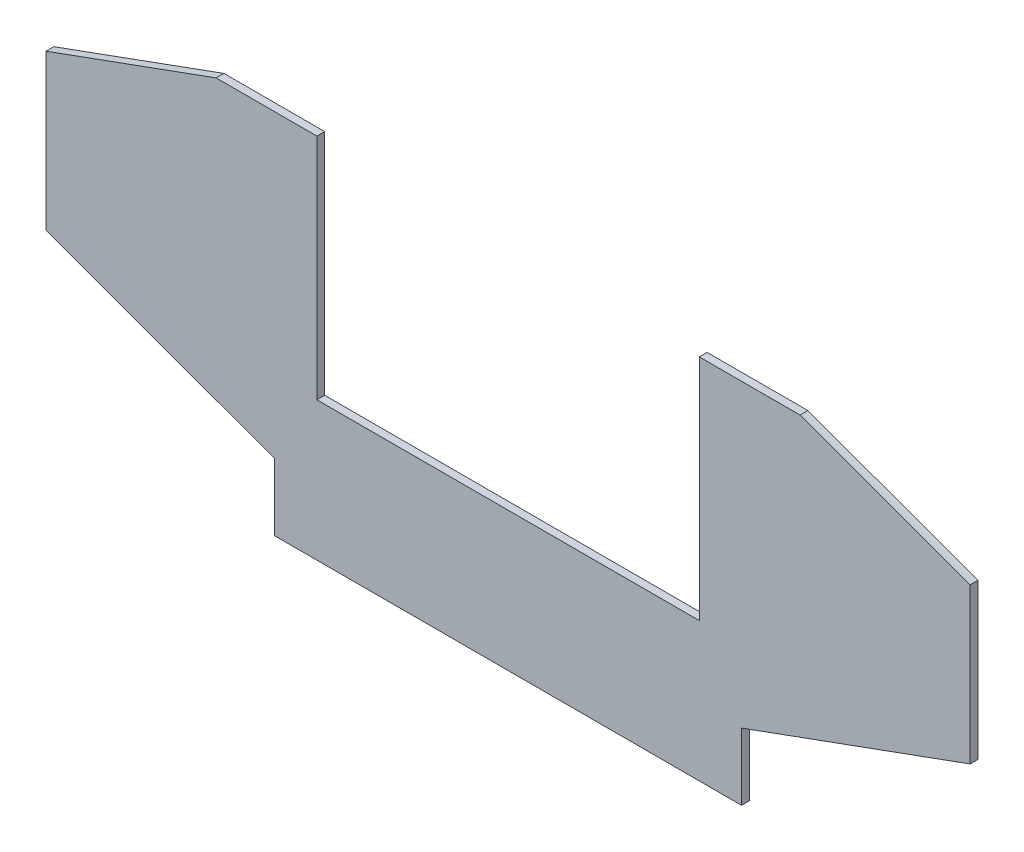
ISO-10303-21;
HEADER;
FILE_DESCRIPTION(('STEP AP214'),'2;1');
FILE_NAME('part.step','',(''),(''),'','','');
FILE_SCHEMA(('AUTOMOTIVE_DESIGN { 1 0 10303 214 1 1 1 1 }'));
ENDSEC;
DATA;
#1=APPLICATION_CONTEXT('core data for automotive mechanical design processes');
#2=APPLICATION_PROTOCOL_DEFINITION('international standard','automotive_design',2000,#1);
#3=PRODUCT_CONTEXT('',#1,'mechanical');
#4=PRODUCT('Part','Part','',(#3));
#5=PRODUCT_RELATED_PRODUCT_CATEGORY('part','',(#4));
#6=PRODUCT_DEFINITION_FORMATION('','',#4);
#7=PRODUCT_DEFINITION_CONTEXT('part definition',#1,'design');
#8=PRODUCT_DEFINITION('design','',#6,#7);
#9=PRODUCT_DEFINITION_SHAPE('','',#8);
#10=(LENGTH_UNIT() NAMED_UNIT(*) SI_UNIT(.MILLI.,.METRE.));
#11=(NAMED_UNIT(*) PLANE_ANGLE_UNIT() SI_UNIT($,.RADIAN.));
#12=(NAMED_UNIT(*) SI_UNIT($,.STERADIAN.) SOLID_ANGLE_UNIT());
#13=UNCERTAINTY_MEASURE_WITH_UNIT(LENGTH_MEASURE(1.E-05),#10,'distance_accuracy_value','');
#14=(GEOMETRIC_REPRESENTATION_CONTEXT(3) GLOBAL_UNCERTAINTY_ASSIGNED_CONTEXT((#13)) GLOBAL_UNIT_ASSIGNED_CONTEXT((#10,
#11,#12)) REPRESENTATION_CONTEXT('',''));
#15=CARTESIAN_POINT('',(0.,0.,0.));
#16=DIRECTION('',(0.,0.,1.));
#17=DIRECTION('',(1.,0.,0.));
#18=AXIS2_PLACEMENT_3D('',#15,#16,#17);
#19=CARTESIAN_POINT('',(49.,-22.7683885339461,2.));
#20=DIRECTION('',(0.,-1.,0.));
#21=DIRECTION('',(1.,0.,0.));
#22=AXIS2_PLACEMENT_3D('',#19,#20,#21);
#23=PLANE('',#22);
#24=DIRECTION('',(-1.,0.,0.));
#25=VECTOR('',#24,1.);
#26=CARTESIAN_POINT('',(49.,-22.7683885339461,0.));
#27=LINE('',#26,#25);
#28=CARTESIAN_POINT('',(49.,-22.7683885339461,0.));
#29=VERTEX_POINT('',#28);
#30=CARTESIAN_POINT('',(-49.,-22.7683885339461,0.));
#31=VERTEX_POINT('',#30);
#32=EDGE_CURVE('E168',#29,#31,#27,.T.);
#33=ORIENTED_EDGE('',*,*,#32,.T.);
#34=DIRECTION('',(0.,0.,-1.));
#35=VECTOR('',#34,1.);
#36=CARTESIAN_POINT('',(-49.,-22.7683885339461,2.));
#37=LINE('',#36,#35);
#38=CARTESIAN_POINT('',(-49.,-22.7683885339461,2.));
#39=VERTEX_POINT('',#38);
#40=EDGE_CURVE('E11',#39,#31,#37,.T.);
#41=ORIENTED_EDGE('',*,*,#40,.F.);
#42=DIRECTION('',(-1.,0.,0.));
#43=VECTOR('',#42,1.);
#44=CARTESIAN_POINT('',(49.,-22.7683885339461,2.));
#45=LINE('',#44,#43);
#46=CARTESIAN_POINT('',(49.,-22.7683885339461,2.));
#47=VERTEX_POINT('',#46);
#48=EDGE_CURVE('E203',#47,#39,#45,.T.);
#49=ORIENTED_EDGE('',*,*,#48,.F.);
#50=DIRECTION('',(0.,0.,-1.));
#51=VECTOR('',#50,1.);
#52=CARTESIAN_POINT('',(49.,-22.7683885339461,2.));
#53=LINE('',#52,#51);
#54=EDGE_CURVE('E49',#47,#29,#53,.T.);
#55=ORIENTED_EDGE('',*,*,#54,.T.);
#56=EDGE_LOOP('',(#33,#41,#49,#55));
#57=FACE_BOUND('',#56,.T.);
#58=ADVANCED_FACE('F33',(#57),#23,.F.);
#59=CARTESIAN_POINT('',(-49.,-22.7683885339461,2.));
#60=DIRECTION('',(-1.,0.,0.));
#61=DIRECTION('',(0.,0.,1.));
#62=AXIS2_PLACEMENT_3D('',#59,#60,#61);
#63=PLANE('',#62);
#64=DIRECTION('',(0.,1.,0.));
#65=VECTOR('',#64,1.);
#66=CARTESIAN_POINT('',(-49.,-22.7683885339461,0.));
#67=LINE('',#66,#65);
#68=CARTESIAN_POINT('',(-49.,35.7571671541559,0.));
#69=VERTEX_POINT('',#68);
#70=EDGE_CURVE('E170',#31,#69,#67,.T.);
#71=ORIENTED_EDGE('',*,*,#70,.T.);
#72=DIRECTION('',(0.,0.,-1.));
#73=VECTOR('',#72,1.);
#74=CARTESIAN_POINT('',(-49.,35.7571671541559,2.));
#75=LINE('',#74,#73);
#76=CARTESIAN_POINT('',(-49.,35.7571671541559,2.));
#77=VERTEX_POINT('',#76);
#78=EDGE_CURVE('E41',#77,#69,#75,.T.);
#79=ORIENTED_EDGE('',*,*,#78,.F.);
#80=DIRECTION('',(0.,1.,0.));
#81=VECTOR('',#80,1.);
#82=CARTESIAN_POINT('',(-49.,-22.7683885339461,2.));
#83=LINE('',#82,#81);
#84=EDGE_CURVE('E106',#39,#77,#83,.T.);
#85=ORIENTED_EDGE('',*,*,#84,.F.);
#86=ORIENTED_EDGE('',*,*,#40,.T.);
#87=EDGE_LOOP('',(#71,#79,#85,#86));
#88=FACE_BOUND('',#87,.T.);
#89=ADVANCED_FACE('F231',(#88),#63,.F.);
#90=CARTESIAN_POINT('',(-74.8245903371274,35.7571671541559,2.));
#91=DIRECTION('',(0.,1.,0.));
#92=DIRECTION('',(-1.,0.,0.));
#93=AXIS2_PLACEMENT_3D('',#90,#91,#92);
#94=PLANE('',#93);
#95=DIRECTION('',(1.,0.,0.));
#96=VECTOR('',#95,1.);
#97=CARTESIAN_POINT('',(-74.8245903371274,35.7571671541559,0.));
#98=LINE('',#97,#96);
#99=CARTESIAN_POINT('',(-74.8245903371274,35.7571671541559,0.));
#100=VERTEX_POINT('',#99);
#101=EDGE_CURVE('E173',#100,#69,#98,.T.);
#102=ORIENTED_EDGE('',*,*,#101,.F.);
#103=DIRECTION('',(0.,0.,-1.));
#104=VECTOR('',#103,1.);
#105=CARTESIAN_POINT('',(-74.8245903371274,35.7571671541559,2.));
#106=LINE('',#105,#104);
#107=CARTESIAN_POINT('',(-74.8245903371274,35.7571671541559,2.));
#108=VERTEX_POINT('',#107);
#109=EDGE_CURVE('E224',#108,#100,#106,.T.);
#110=ORIENTED_EDGE('',*,*,#109,.F.);
#111=DIRECTION('',(1.,0.,0.));
#112=VECTOR('',#111,1.);
#113=CARTESIAN_POINT('',(-74.8245903371274,35.7571671541559,2.));
#114=LINE('',#113,#112);
#115=EDGE_CURVE('E230',#108,#77,#114,.T.);
#116=ORIENTED_EDGE('',*,*,#115,.T.);
#117=ORIENTED_EDGE('',*,*,#78,.T.);
#118=EDGE_LOOP('',(#102,#110,#116,#117));
#119=FACE_BOUND('',#118,.T.);
#120=ADVANCED_FACE('F228',(#119),#94,.T.);
#121=CARTESIAN_POINT('',(-74.8245903371274,35.7571671541559,2.));
#122=DIRECTION('',(0.342020143325673,-0.939692620785907,0.));
#123=DIRECTION('',(0.939692620785907,0.342020143325673,0.));
#124=AXIS2_PLACEMENT_3D('',#121,#122,#123);
#125=PLANE('',#124);
#126=DIRECTION('',(-0.939692620785907,-0.342020143325673,0.));
#127=VECTOR('',#126,1.);
#128=CARTESIAN_POINT('',(-74.8245903371274,35.7571671541559,0.));
#129=LINE('',#128,#127);
#130=CARTESIAN_POINT('',(-118.422151654499,19.888952548037,0.));
#131=VERTEX_POINT('',#130);
#132=EDGE_CURVE('E176',#100,#131,#129,.T.);
#133=ORIENTED_EDGE('',*,*,#132,.T.);
#134=DIRECTION('',(0.,0.,-1.));
#135=VECTOR('',#134,1.);
#136=CARTESIAN_POINT('',(-118.422151654499,19.888952548037,2.));
#137=LINE('',#136,#135);
#138=CARTESIAN_POINT('',(-118.422151654499,19.888952548037,2.));
#139=VERTEX_POINT('',#138);
#140=EDGE_CURVE('E221',#139,#131,#137,.T.);
#141=ORIENTED_EDGE('',*,*,#140,.F.);
#142=DIRECTION('',(-0.939692620785907,-0.342020143325673,0.));
#143=VECTOR('',#142,1.);
#144=CARTESIAN_POINT('',(-74.8245903371274,35.7571671541559,2.));
#145=LINE('',#144,#143);
#146=EDGE_CURVE('E249',#108,#139,#145,.T.);
#147=ORIENTED_EDGE('',*,*,#146,.F.);
#148=ORIENTED_EDGE('',*,*,#109,.T.);
#149=EDGE_LOOP('',(#133,#141,#147,#148));
#150=FACE_BOUND('',#149,.T.);
#151=ADVANCED_FACE('F240',(#150),#125,.F.);
#152=CARTESIAN_POINT('',(-118.422151654499,19.888952548037,2.));
#153=DIRECTION('',(1.,0.,0.));
#154=DIRECTION('',(0.,0.,-1.));
#155=AXIS2_PLACEMENT_3D('',#152,#153,#154);
#156=PLANE('',#155);
#157=DIRECTION('',(0.,-1.,0.));
#158=VECTOR('',#157,1.);
#159=CARTESIAN_POINT('',(-118.422151654499,19.888952548037,0.));
#160=LINE('',#159,#158);
#161=CARTESIAN_POINT('',(-118.422151654499,-19.8889525480371,0.));
#162=VERTEX_POINT('',#161);
#163=EDGE_CURVE('E178',#131,#162,#160,.T.);
#164=ORIENTED_EDGE('',*,*,#163,.T.);
#165=DIRECTION('',(0.,0.,-1.));
#166=VECTOR('',#165,1.);
#167=CARTESIAN_POINT('',(-118.422151654499,-19.8889525480371,2.));
#168=LINE('',#167,#166);
#169=CARTESIAN_POINT('',(-118.422151654499,-19.8889525480371,2.));
#170=VERTEX_POINT('',#169);
#171=EDGE_CURVE('E218',#170,#162,#168,.T.);
#172=ORIENTED_EDGE('',*,*,#171,.F.);
#173=DIRECTION('',(0.,-1.,0.));
#174=VECTOR('',#173,1.);
#175=CARTESIAN_POINT('',(-118.422151654499,19.888952548037,2.));
#176=LINE('',#175,#174);
#177=EDGE_CURVE('E246',#139,#170,#176,.T.);
#178=ORIENTED_EDGE('',*,*,#177,.F.);
#179=ORIENTED_EDGE('',*,*,#140,.T.);
#180=EDGE_LOOP('',(#164,#172,#178,#179));
#181=FACE_BOUND('',#180,.T.);
#182=ADVANCED_FACE('F244',(#181),#156,.F.);
#183=CARTESIAN_POINT('',(-118.422151654499,-19.8889525480371,2.));
#184=DIRECTION('',(0.342020143325673,0.939692620785907,0.));
#185=DIRECTION('',(-0.939692620785907,0.342020143325673,0.));
#186=AXIS2_PLACEMENT_3D('',#183,#184,#185);
#187=PLANE('',#186);
#188=DIRECTION('',(0.939692620785907,-0.342020143325673,0.));
#189=VECTOR('',#188,1.);
#190=CARTESIAN_POINT('',(-118.422151654499,-19.8889525480371,0.));
#191=LINE('',#190,#189);
#192=CARTESIAN_POINT('',(-59.8245903371275,-41.2167206681491,0.));
#193=VERTEX_POINT('',#192);
#194=EDGE_CURVE('E180',#162,#193,#191,.T.);
#195=ORIENTED_EDGE('',*,*,#194,.T.);
#196=DIRECTION('',(0.,0.,-1.));
#197=VECTOR('',#196,1.);
#198=CARTESIAN_POINT('',(-59.8245903371275,-41.2167206681491,2.));
#199=LINE('',#198,#197);
#200=CARTESIAN_POINT('',(-59.8245903371275,-41.2167206681491,2.));
#201=VERTEX_POINT('',#200);
#202=EDGE_CURVE('E215',#201,#193,#199,.T.);
#203=ORIENTED_EDGE('',*,*,#202,.F.);
#204=DIRECTION('',(0.939692620785907,-0.342020143325673,0.));
#205=VECTOR('',#204,1.);
#206=CARTESIAN_POINT('',(-118.422151654499,-19.8889525480371,2.));
#207=LINE('',#206,#205);
#208=EDGE_CURVE('E248',#170,#201,#207,.T.);
#209=ORIENTED_EDGE('',*,*,#208,.F.);
#210=ORIENTED_EDGE('',*,*,#171,.T.);
#211=EDGE_LOOP('',(#195,#203,#209,#210));
#212=FACE_BOUND('',#211,.T.);
#213=ADVANCED_FACE('F297',(#212),#187,.F.);
#214=CARTESIAN_POINT('',(-59.8245903371275,-41.2167206681491,2.));
#215=DIRECTION('',(1.,0.,0.));
#216=DIRECTION('',(0.,0.,-1.));
#217=AXIS2_PLACEMENT_3D('',#214,#215,#216);
#218=PLANE('',#217);
#219=DIRECTION('',(0.,-1.,0.));
#220=VECTOR('',#219,1.);
#221=CARTESIAN_POINT('',(-59.8245903371275,-41.2167206681491,0.));
#222=LINE('',#221,#220);
#223=CARTESIAN_POINT('',(-59.8245903371275,-58.3616114660538,0.));
#224=VERTEX_POINT('',#223);
#225=EDGE_CURVE('E182',#193,#224,#222,.T.);
#226=ORIENTED_EDGE('',*,*,#225,.T.);
#227=DIRECTION('',(0.,0.,-1.));
#228=VECTOR('',#227,1.);
#229=CARTESIAN_POINT('',(-59.8245903371275,-58.3616114660538,2.));
#230=LINE('',#229,#228);
#231=CARTESIAN_POINT('',(-59.8245903371275,-58.3616114660538,2.));
#232=VERTEX_POINT('',#231);
#233=EDGE_CURVE('E213',#232,#224,#230,.T.);
#234=ORIENTED_EDGE('',*,*,#233,.F.);
#235=DIRECTION('',(0.,-1.,0.));
#236=VECTOR('',#235,1.);
#237=CARTESIAN_POINT('',(-59.8245903371275,-41.2167206681491,2.));
#238=LINE('',#237,#236);
#239=EDGE_CURVE('E251',#201,#232,#238,.T.);
#240=ORIENTED_EDGE('',*,*,#239,.F.);
#241=ORIENTED_EDGE('',*,*,#202,.T.);
#242=EDGE_LOOP('',(#226,#234,#240,#241));
#243=FACE_BOUND('',#242,.T.);
#244=ADVANCED_FACE('F300',(#243),#218,.F.);
#245=CARTESIAN_POINT('',(59.8245903371274,-58.3616114660538,2.));
#246=DIRECTION('',(0.,-1.,0.));
#247=DIRECTION('',(1.,0.,0.));
#248=AXIS2_PLACEMENT_3D('',#245,#246,#247);
#249=PLANE('',#248);
#250=DIRECTION('',(-1.,0.,0.));
#251=VECTOR('',#250,1.);
#252=CARTESIAN_POINT('',(59.8245903371274,-58.3616114660538,0.));
#253=LINE('',#252,#251);
#254=CARTESIAN_POINT('',(59.8245903371274,-58.3616114660538,0.));
#255=VERTEX_POINT('',#254);
#256=EDGE_CURVE('E185',#255,#224,#253,.T.);
#257=ORIENTED_EDGE('',*,*,#256,.F.);
#258=DIRECTION('',(0.,0.,-1.));
#259=VECTOR('',#258,1.);
#260=CARTESIAN_POINT('',(59.8245903371274,-58.3616114660538,2.));
#261=LINE('',#260,#259);
#262=CARTESIAN_POINT('',(59.8245903371274,-58.3616114660538,2.));
#263=VERTEX_POINT('',#262);
#264=EDGE_CURVE('E211',#263,#255,#261,.T.);
#265=ORIENTED_EDGE('',*,*,#264,.F.);
#266=DIRECTION('',(-1.,0.,0.));
#267=VECTOR('',#266,1.);
#268=CARTESIAN_POINT('',(59.8245903371274,-58.3616114660538,2.));
#269=LINE('',#268,#267);
#270=EDGE_CURVE('E257',#263,#232,#269,.T.);
#271=ORIENTED_EDGE('',*,*,#270,.T.);
#272=ORIENTED_EDGE('',*,*,#233,.T.);
#273=EDGE_LOOP('',(#257,#265,#271,#272));
#274=FACE_BOUND('',#273,.T.);
#275=ADVANCED_FACE('F304',(#274),#249,.T.);
#276=CARTESIAN_POINT('',(59.8245903371274,-41.2167206681491,2.));
#277=DIRECTION('',(1.,0.,0.));
#278=DIRECTION('',(0.,1.,0.));
#279=AXIS2_PLACEMENT_3D('',#276,#277,#278);
#280=PLANE('',#279);
#281=DIRECTION('',(0.,-1.,0.));
#282=VECTOR('',#281,1.);
#283=CARTESIAN_POINT('',(59.8245903371274,-41.2167206681491,0.));
#284=LINE('',#283,#282);
#285=CARTESIAN_POINT('',(59.8245903371274,-41.2167206681491,0.));
#286=VERTEX_POINT('',#285);
#287=EDGE_CURVE('E188',#286,#255,#284,.T.);
#288=ORIENTED_EDGE('',*,*,#287,.F.);
#289=DIRECTION('',(0.,0.,-1.));
#290=VECTOR('',#289,1.);
#291=CARTESIAN_POINT('',(59.8245903371274,-41.2167206681491,2.));
#292=LINE('',#291,#290);
#293=CARTESIAN_POINT('',(59.8245903371274,-41.2167206681491,2.));
#294=VERTEX_POINT('',#293);
#295=EDGE_CURVE('E209',#294,#286,#292,.T.);
#296=ORIENTED_EDGE('',*,*,#295,.F.);
#297=DIRECTION('',(0.,-1.,0.));
#298=VECTOR('',#297,1.);
#299=CARTESIAN_POINT('',(59.8245903371274,-41.2167206681491,2.));
#300=LINE('',#299,#298);
#301=EDGE_CURVE('E260',#294,#263,#300,.T.);
#302=ORIENTED_EDGE('',*,*,#301,.T.);
#303=ORIENTED_EDGE('',*,*,#264,.T.);
#304=EDGE_LOOP('',(#288,#296,#302,#303));
#305=FACE_BOUND('',#304,.T.);
#306=ADVANCED_FACE('F308',(#305),#280,.T.);
#307=CARTESIAN_POINT('',(118.422151654499,-19.888952548037,2.));
#308=DIRECTION('',(0.342020143325673,-0.939692620785907,0.));
#309=DIRECTION('',(0.939692620785907,0.342020143325673,0.));
#310=AXIS2_PLACEMENT_3D('',#307,#308,#309);
#311=PLANE('',#310);
#312=DIRECTION('',(-0.939692620785907,-0.342020143325673,0.));
#313=VECTOR('',#312,1.);
#314=CARTESIAN_POINT('',(118.422151654499,-19.888952548037,0.));
#315=LINE('',#314,#313);
#316=CARTESIAN_POINT('',(118.422151654499,-19.888952548037,0.));
#317=VERTEX_POINT('',#316);
#318=EDGE_CURVE('E191',#317,#286,#315,.T.);
#319=ORIENTED_EDGE('',*,*,#318,.F.);
#320=DIRECTION('',(0.,0.,-1.));
#321=VECTOR('',#320,1.);
#322=CARTESIAN_POINT('',(118.422151654499,-19.888952548037,2.));
#323=LINE('',#322,#321);
#324=CARTESIAN_POINT('',(118.422151654499,-19.888952548037,2.));
#325=VERTEX_POINT('',#324);
#326=EDGE_CURVE('E207',#325,#317,#323,.T.);
#327=ORIENTED_EDGE('',*,*,#326,.F.);
#328=DIRECTION('',(-0.939692620785907,-0.342020143325673,0.));
#329=VECTOR('',#328,1.);
#330=CARTESIAN_POINT('',(118.422151654499,-19.888952548037,2.));
#331=LINE('',#330,#329);
#332=EDGE_CURVE('E163',#325,#294,#331,.T.);
#333=ORIENTED_EDGE('',*,*,#332,.T.);
#334=ORIENTED_EDGE('',*,*,#295,.T.);
#335=EDGE_LOOP('',(#319,#327,#333,#334));
#336=FACE_BOUND('',#335,.T.);
#337=ADVANCED_FACE('F265',(#336),#311,.T.);
#338=CARTESIAN_POINT('',(118.422151654499,19.888952548037,2.));
#339=DIRECTION('',(1.,0.,0.));
#340=DIRECTION('',(0.,0.,-1.));
#341=AXIS2_PLACEMENT_3D('',#338,#339,#340);
#342=PLANE('',#341);
#343=DIRECTION('',(0.,-1.,0.));
#344=VECTOR('',#343,1.);
#345=CARTESIAN_POINT('',(118.422151654499,19.888952548037,0.));
#346=LINE('',#345,#344);
#347=CARTESIAN_POINT('',(118.422151654499,19.888952548037,0.));
#348=VERTEX_POINT('',#347);
#349=EDGE_CURVE('E194',#348,#317,#346,.T.);
#350=ORIENTED_EDGE('',*,*,#349,.F.);
#351=DIRECTION('',(0.,0.,-1.));
#352=VECTOR('',#351,1.);
#353=CARTESIAN_POINT('',(118.422151654499,19.888952548037,2.));
#354=LINE('',#353,#352);
#355=CARTESIAN_POINT('',(118.422151654499,19.888952548037,2.));
#356=VERTEX_POINT('',#355);
#357=EDGE_CURVE('E149',#356,#348,#354,.T.);
#358=ORIENTED_EDGE('',*,*,#357,.F.);
#359=DIRECTION('',(0.,-1.,0.));
#360=VECTOR('',#359,1.);
#361=CARTESIAN_POINT('',(118.422151654499,19.888952548037,2.));
#362=LINE('',#361,#360);
#363=EDGE_CURVE('E161',#356,#325,#362,.T.);
#364=ORIENTED_EDGE('',*,*,#363,.T.);
#365=ORIENTED_EDGE('',*,*,#326,.T.);
#366=EDGE_LOOP('',(#350,#358,#364,#365));
#367=FACE_BOUND('',#366,.T.);
#368=ADVANCED_FACE('F271',(#367),#342,.T.);
#369=CARTESIAN_POINT('',(74.8245903371274,35.7571671541559,2.));
#370=DIRECTION('',(0.342020143325673,0.939692620785907,0.));
#371=DIRECTION('',(-0.939692620785907,0.342020143325673,0.));
#372=AXIS2_PLACEMENT_3D('',#369,#370,#371);
#373=PLANE('',#372);
#374=DIRECTION('',(0.939692620785907,-0.342020143325673,0.));
#375=VECTOR('',#374,1.);
#376=CARTESIAN_POINT('',(74.8245903371274,35.7571671541559,0.));
#377=LINE('',#376,#375);
#378=CARTESIAN_POINT('',(74.8245903371274,35.7571671541559,0.));
#379=VERTEX_POINT('',#378);
#380=EDGE_CURVE('E146',#379,#348,#377,.T.);
#381=ORIENTED_EDGE('',*,*,#380,.F.);
#382=DIRECTION('',(0.,0.,-1.));
#383=VECTOR('',#382,1.);
#384=CARTESIAN_POINT('',(74.8245903371274,35.7571671541559,2.));
#385=LINE('',#384,#383);
#386=CARTESIAN_POINT('',(74.8245903371274,35.7571671541559,2.));
#387=VERTEX_POINT('',#386);
#388=EDGE_CURVE('E140',#387,#379,#385,.T.);
#389=ORIENTED_EDGE('',*,*,#388,.F.);
#390=DIRECTION('',(0.939692620785907,-0.342020143325673,0.));
#391=VECTOR('',#390,1.);
#392=CARTESIAN_POINT('',(74.8245903371274,35.7571671541559,2.));
#393=LINE('',#392,#391);
#394=EDGE_CURVE('E144',#387,#356,#393,.T.);
#395=ORIENTED_EDGE('',*,*,#394,.T.);
#396=ORIENTED_EDGE('',*,*,#357,.T.);
#397=EDGE_LOOP('',(#381,#389,#395,#396));
#398=FACE_BOUND('',#397,.T.);
#399=ADVANCED_FACE('F142',(#398),#373,.T.);
#400=CARTESIAN_POINT('',(74.8245903371274,35.7571671541559,2.));
#401=DIRECTION('',(0.,-1.,0.));
#402=DIRECTION('',(1.,0.,0.));
#403=AXIS2_PLACEMENT_3D('',#400,#401,#402);
#404=PLANE('',#403);
#405=DIRECTION('',(-1.,0.,0.));
#406=VECTOR('',#405,1.);
#407=CARTESIAN_POINT('',(74.8245903371274,35.7571671541559,0.));
#408=LINE('',#407,#406);
#409=CARTESIAN_POINT('',(49.,35.7571671541559,0.));
#410=VERTEX_POINT('',#409);
#411=EDGE_CURVE('E198',#379,#410,#408,.T.);
#412=ORIENTED_EDGE('',*,*,#411,.T.);
#413=DIRECTION('',(0.,0.,-1.));
#414=VECTOR('',#413,1.);
#415=CARTESIAN_POINT('',(49.,35.7571671541559,2.));
#416=LINE('',#415,#414);
#417=CARTESIAN_POINT('',(49.,35.7571671541559,2.));
#418=VERTEX_POINT('',#417);
#419=EDGE_CURVE('E94',#418,#410,#416,.T.);
#420=ORIENTED_EDGE('',*,*,#419,.F.);
#421=DIRECTION('',(-1.,0.,0.));
#422=VECTOR('',#421,1.);
#423=CARTESIAN_POINT('',(74.8245903371274,35.7571671541559,2.));
#424=LINE('',#423,#422);
#425=EDGE_CURVE('E151',#387,#418,#424,.T.);
#426=ORIENTED_EDGE('',*,*,#425,.F.);
#427=ORIENTED_EDGE('',*,*,#388,.T.);
#428=EDGE_LOOP('',(#412,#420,#426,#427));
#429=FACE_BOUND('',#428,.T.);
#430=ADVANCED_FACE('F152',(#429),#404,.F.);
#431=CARTESIAN_POINT('',(49.,-22.7683885339461,2.));
#432=DIRECTION('',(-1.,0.,0.));
#433=DIRECTION('',(0.,0.,1.));
#434=AXIS2_PLACEMENT_3D('',#431,#432,#433);
#435=PLANE('',#434);
#436=DIRECTION('',(0.,1.,0.));
#437=VECTOR('',#436,1.);
#438=CARTESIAN_POINT('',(49.,-22.7683885339461,0.));
#439=LINE('',#438,#437);
#440=EDGE_CURVE('E200',#29,#410,#439,.T.);
#441=ORIENTED_EDGE('',*,*,#440,.F.);
#442=ORIENTED_EDGE('',*,*,#54,.F.);
#443=DIRECTION('',(0.,1.,0.));
#444=VECTOR('',#443,1.);
#445=CARTESIAN_POINT('',(49.,-22.7683885339461,2.));
#446=LINE('',#445,#444);
#447=EDGE_CURVE('E155',#47,#418,#446,.T.);
#448=ORIENTED_EDGE('',*,*,#447,.T.);
#449=ORIENTED_EDGE('',*,*,#419,.T.);
#450=EDGE_LOOP('',(#441,#442,#448,#449));
#451=FACE_BOUND('',#450,.T.);
#452=ADVANCED_FACE('F272',(#451),#435,.T.);
#453=CARTESIAN_POINT('',(0.,0.,2.));
#454=DIRECTION('',(0.,0.,-1.));
#455=DIRECTION('',(-1.,0.,0.));
#456=AXIS2_PLACEMENT_3D('',#453,#454,#455);
#457=PLANE('',#456);
#458=ORIENTED_EDGE('',*,*,#48,.T.);
#459=ORIENTED_EDGE('',*,*,#84,.T.);
#460=ORIENTED_EDGE('',*,*,#115,.F.);
#461=ORIENTED_EDGE('',*,*,#146,.T.);
#462=ORIENTED_EDGE('',*,*,#177,.T.);
#463=ORIENTED_EDGE('',*,*,#208,.T.);
#464=ORIENTED_EDGE('',*,*,#239,.T.);
#465=ORIENTED_EDGE('',*,*,#270,.F.);
#466=ORIENTED_EDGE('',*,*,#301,.F.);
#467=ORIENTED_EDGE('',*,*,#332,.F.);
#468=ORIENTED_EDGE('',*,*,#363,.F.);
#469=ORIENTED_EDGE('',*,*,#394,.F.);
#470=ORIENTED_EDGE('',*,*,#425,.T.);
#471=ORIENTED_EDGE('',*,*,#447,.F.);
#472=EDGE_LOOP('',(#458,#459,#460,#461,#462,#463,#464,#465,#466,#467,#468,#469,#470,#471));
#473=FACE_BOUND('',#472,.T.);
#474=ADVANCED_FACE('F158',(#473),#457,.F.);
#475=CARTESIAN_POINT('',(0.,0.,0.));
#476=DIRECTION('',(0.,0.,-1.));
#477=DIRECTION('',(-1.,0.,0.));
#478=AXIS2_PLACEMENT_3D('',#475,#476,#477);
#479=PLANE('',#478);
#480=ORIENTED_EDGE('',*,*,#32,.F.);
#481=ORIENTED_EDGE('',*,*,#440,.T.);
#482=ORIENTED_EDGE('',*,*,#411,.F.);
#483=ORIENTED_EDGE('',*,*,#380,.T.);
#484=ORIENTED_EDGE('',*,*,#349,.T.);
#485=ORIENTED_EDGE('',*,*,#318,.T.);
#486=ORIENTED_EDGE('',*,*,#287,.T.);
#487=ORIENTED_EDGE('',*,*,#256,.T.);
#488=ORIENTED_EDGE('',*,*,#225,.F.);
#489=ORIENTED_EDGE('',*,*,#194,.F.);
#490=ORIENTED_EDGE('',*,*,#163,.F.);
#491=ORIENTED_EDGE('',*,*,#132,.F.);
#492=ORIENTED_EDGE('',*,*,#101,.T.);
#493=ORIENTED_EDGE('',*,*,#70,.F.);
#494=EDGE_LOOP('',(#480,#481,#482,#483,#484,#485,#486,#487,#488,#489,#490,#491,#492,#493));
#495=FACE_BOUND('',#494,.T.);
#496=ADVANCED_FACE('F235',(#495),#479,.T.);
#497=CLOSED_SHELL('',(#58,#89,#120,#151,#182,#213,#244,#275,#306,#337,#368,#399,#430,#452,#474,#496));
#498=MANIFOLD_SOLID_BREP('B2',#497);
#499=ADVANCED_BREP_SHAPE_REPRESENTATION('',(#18,#498),#14);
#500=SHAPE_DEFINITION_REPRESENTATION(#9,#499);
ENDSEC;
END-ISO-10303-21;
